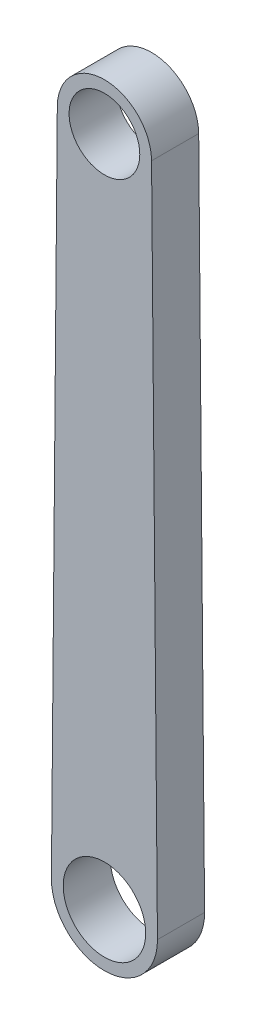
ISO-10303-21;
HEADER;
FILE_DESCRIPTION(('STEP AP214'),'2;1');
FILE_NAME('part.step','',(''),(''),'','','');
FILE_SCHEMA(('AUTOMOTIVE_DESIGN { 1 0 10303 214 1 1 1 1 }'));
ENDSEC;
DATA;
#1=APPLICATION_CONTEXT('core data for automotive mechanical design processes');
#2=APPLICATION_PROTOCOL_DEFINITION('international standard','automotive_design',2000,#1);
#3=PRODUCT_CONTEXT('',#1,'mechanical');
#4=PRODUCT('Part','Part','',(#3));
#5=PRODUCT_RELATED_PRODUCT_CATEGORY('part','',(#4));
#6=PRODUCT_DEFINITION_FORMATION('','',#4);
#7=PRODUCT_DEFINITION_CONTEXT('part definition',#1,'design');
#8=PRODUCT_DEFINITION('design','',#6,#7);
#9=PRODUCT_DEFINITION_SHAPE('','',#8);
#10=(LENGTH_UNIT() NAMED_UNIT(*) SI_UNIT(.MILLI.,.METRE.));
#11=(NAMED_UNIT(*) PLANE_ANGLE_UNIT() SI_UNIT($,.RADIAN.));
#12=(NAMED_UNIT(*) SI_UNIT($,.STERADIAN.) SOLID_ANGLE_UNIT());
#13=UNCERTAINTY_MEASURE_WITH_UNIT(LENGTH_MEASURE(1.E-05),#10,'distance_accuracy_value','');
#14=(GEOMETRIC_REPRESENTATION_CONTEXT(3) GLOBAL_UNCERTAINTY_ASSIGNED_CONTEXT((#13)) GLOBAL_UNIT_ASSIGNED_CONTEXT((#10,
#11,#12)) REPRESENTATION_CONTEXT('',''));
#15=CARTESIAN_POINT('',(0.,0.,0.));
#16=DIRECTION('',(0.,0.,1.));
#17=DIRECTION('',(1.,0.,0.));
#18=AXIS2_PLACEMENT_3D('',#15,#16,#17);
#19=CARTESIAN_POINT('',(-3.99984610353379,0.0350877192982451,2.));
#20=DIRECTION('',(0.999961525883448,-0.00877192982456127,0.));
#21=DIRECTION('',(0.00877192982456127,0.999961525883448,0.));
#22=AXIS2_PLACEMENT_3D('',#19,#20,#21);
#23=PLANE('',#22);
#24=DIRECTION('',(-0.00877192982456127,-0.999961525883448,0.));
#25=VECTOR('',#24,1.);
#26=CARTESIAN_POINT('',(-3.99984610353379,0.0350877192982451,-2.));
#27=LINE('',#26,#25);
#28=CARTESIAN_POINT('',(-3.99984610353379,0.035087719298245,-2.));
#29=VERTEX_POINT('',#28);
#30=CARTESIAN_POINT('',(-4.49982686647551,-56.9605263157895,-2.));
#31=VERTEX_POINT('',#30);
#32=EDGE_CURVE('E114',#29,#31,#27,.T.);
#33=ORIENTED_EDGE('',*,*,#32,.T.);
#34=DIRECTION('',(0.,0.,-1.));
#35=VECTOR('',#34,1.);
#36=CARTESIAN_POINT('',(-4.49982686647551,-56.9605263157895,2.));
#37=LINE('',#36,#35);
#38=CARTESIAN_POINT('',(-4.49982686647551,-56.9605263157895,2.));
#39=VERTEX_POINT('',#38);
#40=EDGE_CURVE('E11',#39,#31,#37,.T.);
#41=ORIENTED_EDGE('',*,*,#40,.F.);
#42=DIRECTION('',(-0.00877192982456127,-0.999961525883448,0.));
#43=VECTOR('',#42,1.);
#44=CARTESIAN_POINT('',(-3.99984610353379,0.0350877192982451,2.));
#45=LINE('',#44,#43);
#46=CARTESIAN_POINT('',(-3.99984610353379,0.035087719298245,2.));
#47=VERTEX_POINT('',#46);
#48=EDGE_CURVE('E93',#47,#39,#45,.T.);
#49=ORIENTED_EDGE('',*,*,#48,.F.);
#50=DIRECTION('',(0.,0.,-1.));
#51=VECTOR('',#50,1.);
#52=CARTESIAN_POINT('',(-3.99984610353379,0.035087719298245,2.));
#53=LINE('',#52,#51);
#54=EDGE_CURVE('E113',#47,#29,#53,.T.);
#55=ORIENTED_EDGE('',*,*,#54,.T.);
#56=EDGE_LOOP('',(#33,#41,#49,#55));
#57=FACE_BOUND('',#56,.T.);
#58=ADVANCED_FACE('F45',(#57),#23,.F.);
#59=CARTESIAN_POINT('',(0.,-57.,2.));
#60=DIRECTION('',(0.,0.,-1.));
#61=DIRECTION('',(-1.,0.,0.));
#62=AXIS2_PLACEMENT_3D('',#59,#60,#61);
#63=CYLINDRICAL_SURFACE('',#62,4.5);
#64=CARTESIAN_POINT('',(0.,-57.,-2.));
#65=DIRECTION('',(0.,0.,1.));
#66=DIRECTION('',(1.,0.,0.));
#67=AXIS2_PLACEMENT_3D('',#64,#65,#66);
#68=CIRCLE('',#67,4.5);
#69=CARTESIAN_POINT('',(4.49982686647552,-56.9605263157895,-2.));
#70=VERTEX_POINT('',#69);
#71=EDGE_CURVE('E98',#31,#70,#68,.T.);
#72=ORIENTED_EDGE('',*,*,#71,.T.);
#73=DIRECTION('',(0.,0.,-1.));
#74=VECTOR('',#73,1.);
#75=CARTESIAN_POINT('',(4.49982686647552,-56.9605263157895,2.));
#76=LINE('',#75,#74);
#77=CARTESIAN_POINT('',(4.49982686647552,-56.9605263157895,2.));
#78=VERTEX_POINT('',#77);
#79=EDGE_CURVE('E53',#78,#70,#76,.T.);
#80=ORIENTED_EDGE('',*,*,#79,.F.);
#81=CARTESIAN_POINT('',(0.,-57.,2.));
#82=DIRECTION('',(0.,0.,1.));
#83=DIRECTION('',(1.,0.,0.));
#84=AXIS2_PLACEMENT_3D('',#81,#82,#83);
#85=CIRCLE('',#84,4.5);
#86=EDGE_CURVE('E87',#39,#78,#85,.T.);
#87=ORIENTED_EDGE('',*,*,#86,.F.);
#88=ORIENTED_EDGE('',*,*,#40,.T.);
#89=EDGE_LOOP('',(#72,#80,#87,#88));
#90=FACE_BOUND('',#89,.T.);
#91=ADVANCED_FACE('F97',(#90),#63,.T.);
#92=CARTESIAN_POINT('',(3.99984610353379,0.0350877192982461,2.));
#93=DIRECTION('',(0.999961525883448,0.00877192982456152,0.));
#94=DIRECTION('',(-0.00877192982456152,0.999961525883448,0.));
#95=AXIS2_PLACEMENT_3D('',#92,#93,#94);
#96=PLANE('',#95);
#97=DIRECTION('',(0.00877192982456152,-0.999961525883448,0.));
#98=VECTOR('',#97,1.);
#99=CARTESIAN_POINT('',(3.99984610353379,0.0350877192982461,-2.));
#100=LINE('',#99,#98);
#101=CARTESIAN_POINT('',(3.99984610353379,0.035087719298246,-2.));
#102=VERTEX_POINT('',#101);
#103=EDGE_CURVE('E118',#102,#70,#100,.T.);
#104=ORIENTED_EDGE('',*,*,#103,.F.);
#105=DIRECTION('',(0.,0.,-1.));
#106=VECTOR('',#105,1.);
#107=CARTESIAN_POINT('',(3.99984610353379,0.035087719298246,2.));
#108=LINE('',#107,#106);
#109=CARTESIAN_POINT('',(3.99984610353379,0.035087719298246,2.));
#110=VERTEX_POINT('',#109);
#111=EDGE_CURVE('E77',#110,#102,#108,.T.);
#112=ORIENTED_EDGE('',*,*,#111,.F.);
#113=DIRECTION('',(0.00877192982456152,-0.999961525883448,0.));
#114=VECTOR('',#113,1.);
#115=CARTESIAN_POINT('',(3.99984610353379,0.0350877192982461,2.));
#116=LINE('',#115,#114);
#117=EDGE_CURVE('E91',#110,#78,#116,.T.);
#118=ORIENTED_EDGE('',*,*,#117,.T.);
#119=ORIENTED_EDGE('',*,*,#79,.T.);
#120=EDGE_LOOP('',(#104,#112,#118,#119));
#121=FACE_BOUND('',#120,.T.);
#122=ADVANCED_FACE('F102',(#121),#96,.T.);
#123=CARTESIAN_POINT('',(0.,0.,2.));
#124=DIRECTION('',(0.,0.,-1.));
#125=DIRECTION('',(-1.,0.,0.));
#126=AXIS2_PLACEMENT_3D('',#123,#124,#125);
#127=CYLINDRICAL_SURFACE('',#126,3.);
#128=CARTESIAN_POINT('',(0.,0.,2.));
#129=DIRECTION('',(0.,0.,1.));
#130=DIRECTION('',(1.,0.,0.));
#131=AXIS2_PLACEMENT_3D('',#128,#129,#130);
#132=CIRCLE('',#131,3.);
#133=CARTESIAN_POINT('',(3.,0.,2.));
#134=VERTEX_POINT('',#133);
#135=EDGE_CURVE('E104',#134,#134,#132,.T.);
#136=ORIENTED_EDGE('',*,*,#135,.T.);
#137=EDGE_LOOP('',(#136));
#138=FACE_BOUND('',#137,.T.);
#139=CARTESIAN_POINT('',(0.,0.,-2.));
#140=DIRECTION('',(0.,0.,1.));
#141=DIRECTION('',(1.,0.,0.));
#142=AXIS2_PLACEMENT_3D('',#139,#140,#141);
#143=CIRCLE('',#142,3.);
#144=CARTESIAN_POINT('',(3.,0.,-2.));
#145=VERTEX_POINT('',#144);
#146=EDGE_CURVE('E121',#145,#145,#143,.T.);
#147=ORIENTED_EDGE('',*,*,#146,.F.);
#148=EDGE_LOOP('',(#147));
#149=FACE_BOUND('',#148,.T.);
#150=ADVANCED_FACE('F149',(#138,#149),#127,.F.);
#151=CARTESIAN_POINT('',(0.,0.,2.));
#152=DIRECTION('',(0.,0.,-1.));
#153=DIRECTION('',(-1.,0.,0.));
#154=AXIS2_PLACEMENT_3D('',#151,#152,#153);
#155=CYLINDRICAL_SURFACE('',#154,4.);
#156=CARTESIAN_POINT('',(0.,0.,-2.));
#157=DIRECTION('',(0.,0.,1.));
#158=DIRECTION('',(1.,0.,0.));
#159=AXIS2_PLACEMENT_3D('',#156,#157,#158);
#160=CIRCLE('',#159,4.);
#161=EDGE_CURVE('E80',#102,#29,#160,.T.);
#162=ORIENTED_EDGE('',*,*,#161,.T.);
#163=ORIENTED_EDGE('',*,*,#54,.F.);
#164=CARTESIAN_POINT('',(0.,0.,2.));
#165=DIRECTION('',(0.,0.,1.));
#166=DIRECTION('',(1.,0.,0.));
#167=AXIS2_PLACEMENT_3D('',#164,#165,#166);
#168=CIRCLE('',#167,4.);
#169=EDGE_CURVE('E61',#110,#47,#168,.T.);
#170=ORIENTED_EDGE('',*,*,#169,.F.);
#171=ORIENTED_EDGE('',*,*,#111,.T.);
#172=EDGE_LOOP('',(#162,#163,#170,#171));
#173=FACE_BOUND('',#172,.T.);
#174=ADVANCED_FACE('F141',(#173),#155,.T.);
#175=CARTESIAN_POINT('',(0.,-57.,2.));
#176=DIRECTION('',(0.,0.,-1.));
#177=DIRECTION('',(-1.,0.,0.));
#178=AXIS2_PLACEMENT_3D('',#175,#176,#177);
#179=CYLINDRICAL_SURFACE('',#178,3.5);
#180=CARTESIAN_POINT('',(0.,-57.,2.));
#181=DIRECTION('',(0.,0.,1.));
#182=DIRECTION('',(1.,0.,0.));
#183=AXIS2_PLACEMENT_3D('',#180,#181,#182);
#184=CIRCLE('',#183,3.5);
#185=CARTESIAN_POINT('',(3.50000000000001,-57.,2.));
#186=VERTEX_POINT('',#185);
#187=EDGE_CURVE('E110',#186,#186,#184,.T.);
#188=ORIENTED_EDGE('',*,*,#187,.T.);
#189=EDGE_LOOP('',(#188));
#190=FACE_BOUND('',#189,.T.);
#191=CARTESIAN_POINT('',(0.,-57.,-2.));
#192=DIRECTION('',(0.,0.,1.));
#193=DIRECTION('',(1.,0.,0.));
#194=AXIS2_PLACEMENT_3D('',#191,#192,#193);
#195=CIRCLE('',#194,3.5);
#196=CARTESIAN_POINT('',(3.50000000000001,-57.,-2.));
#197=VERTEX_POINT('',#196);
#198=EDGE_CURVE('E124',#197,#197,#195,.T.);
#199=ORIENTED_EDGE('',*,*,#198,.F.);
#200=EDGE_LOOP('',(#199));
#201=FACE_BOUND('',#200,.T.);
#202=ADVANCED_FACE('F139',(#190,#201),#179,.F.);
#203=CARTESIAN_POINT('',(0.,0.,2.));
#204=DIRECTION('',(0.,0.,1.));
#205=DIRECTION('',(1.,0.,0.));
#206=AXIS2_PLACEMENT_3D('',#203,#204,#205);
#207=PLANE('',#206);
#208=ORIENTED_EDGE('',*,*,#48,.T.);
#209=ORIENTED_EDGE('',*,*,#86,.T.);
#210=ORIENTED_EDGE('',*,*,#117,.F.);
#211=ORIENTED_EDGE('',*,*,#169,.T.);
#212=EDGE_LOOP('',(#208,#209,#210,#211));
#213=FACE_BOUND('',#212,.T.);
#214=ORIENTED_EDGE('',*,*,#135,.F.);
#215=EDGE_LOOP('',(#214));
#216=FACE_BOUND('',#215,.T.);
#217=ORIENTED_EDGE('',*,*,#187,.F.);
#218=EDGE_LOOP('',(#217));
#219=FACE_BOUND('',#218,.T.);
#220=ADVANCED_FACE('F88',(#213,#216,#219),#207,.T.);
#221=CARTESIAN_POINT('',(0.,0.,-2.));
#222=DIRECTION('',(0.,0.,1.));
#223=DIRECTION('',(1.,0.,0.));
#224=AXIS2_PLACEMENT_3D('',#221,#222,#223);
#225=PLANE('',#224);
#226=ORIENTED_EDGE('',*,*,#32,.F.);
#227=ORIENTED_EDGE('',*,*,#161,.F.);
#228=ORIENTED_EDGE('',*,*,#103,.T.);
#229=ORIENTED_EDGE('',*,*,#71,.F.);
#230=EDGE_LOOP('',(#226,#227,#228,#229));
#231=FACE_BOUND('',#230,.T.);
#232=ORIENTED_EDGE('',*,*,#146,.T.);
#233=EDGE_LOOP('',(#232));
#234=FACE_BOUND('',#233,.T.);
#235=ORIENTED_EDGE('',*,*,#198,.T.);
#236=EDGE_LOOP('',(#235));
#237=FACE_BOUND('',#236,.T.);
#238=ADVANCED_FACE('F131',(#231,#234,#237),#225,.F.);
#239=CLOSED_SHELL('',(#58,#91,#122,#150,#174,#202,#220,#238));
#240=MANIFOLD_SOLID_BREP('B2',#239);
#241=ADVANCED_BREP_SHAPE_REPRESENTATION('',(#18,#240),#14);
#242=SHAPE_DEFINITION_REPRESENTATION(#9,#241);
ENDSEC;
END-ISO-10303-21;
